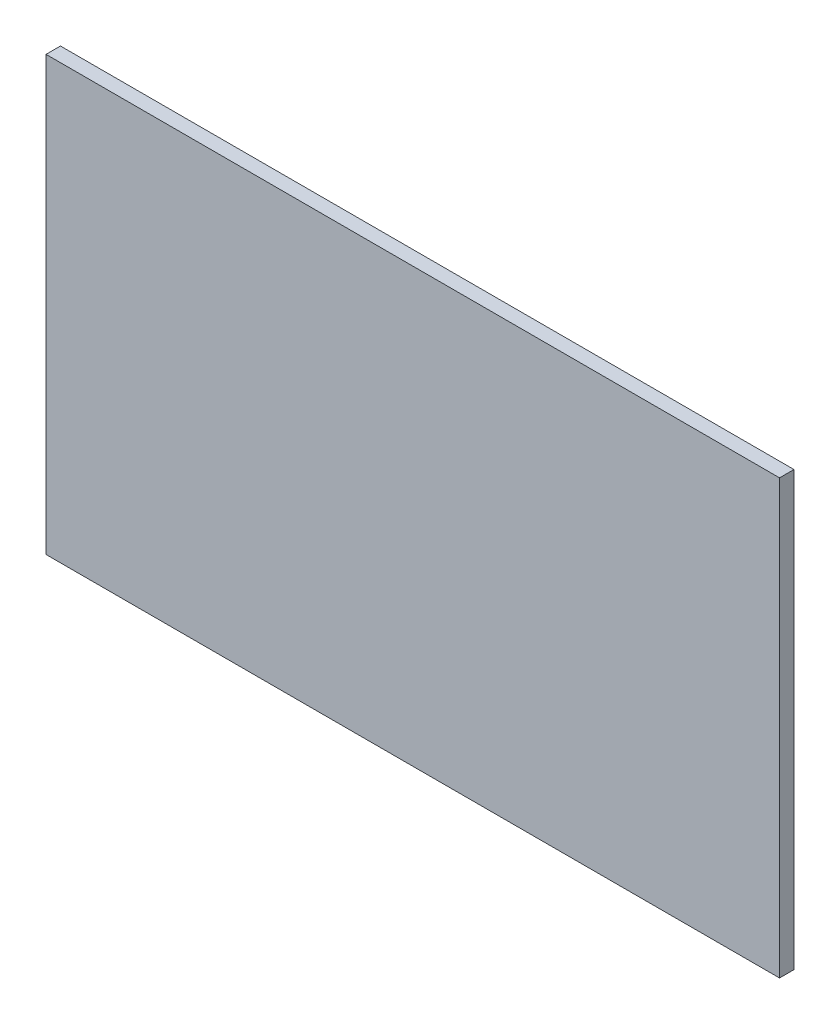
ISO-10303-21;
HEADER;
FILE_DESCRIPTION(('STEP AP214'),'2;1');
FILE_NAME('part.step','',(''),(''),'','','');
FILE_SCHEMA(('AUTOMOTIVE_DESIGN { 1 0 10303 214 1 1 1 1 }'));
ENDSEC;
DATA;
#1=APPLICATION_CONTEXT('core data for automotive mechanical design processes');
#2=APPLICATION_PROTOCOL_DEFINITION('international standard','automotive_design',2000,#1);
#3=PRODUCT_CONTEXT('',#1,'mechanical');
#4=PRODUCT('Part','Part','',(#3));
#5=PRODUCT_RELATED_PRODUCT_CATEGORY('part','',(#4));
#6=PRODUCT_DEFINITION_FORMATION('','',#4);
#7=PRODUCT_DEFINITION_CONTEXT('part definition',#1,'design');
#8=PRODUCT_DEFINITION('design','',#6,#7);
#9=PRODUCT_DEFINITION_SHAPE('','',#8);
#10=(LENGTH_UNIT() NAMED_UNIT(*) SI_UNIT(.MILLI.,.METRE.));
#11=(NAMED_UNIT(*) PLANE_ANGLE_UNIT() SI_UNIT($,.RADIAN.));
#12=(NAMED_UNIT(*) SI_UNIT($,.STERADIAN.) SOLID_ANGLE_UNIT());
#13=UNCERTAINTY_MEASURE_WITH_UNIT(LENGTH_MEASURE(1.E-05),#10,'distance_accuracy_value','');
#14=(GEOMETRIC_REPRESENTATION_CONTEXT(3) GLOBAL_UNCERTAINTY_ASSIGNED_CONTEXT((#13)) GLOBAL_UNIT_ASSIGNED_CONTEXT((#10,
#11,#12)) REPRESENTATION_CONTEXT('',''));
#15=CARTESIAN_POINT('',(0.,0.,0.));
#16=DIRECTION('',(0.,0.,1.));
#17=DIRECTION('',(1.,0.,0.));
#18=AXIS2_PLACEMENT_3D('',#15,#16,#17);
#19=CARTESIAN_POINT('',(25.4,-15.,1.));
#20=DIRECTION('',(-1.,0.,0.));
#21=DIRECTION('',(0.,0.,1.));
#22=AXIS2_PLACEMENT_3D('',#19,#20,#21);
#23=PLANE('',#22);
#24=DIRECTION('',(0.,1.,0.));
#25=VECTOR('',#24,1.);
#26=CARTESIAN_POINT('',(25.4,-15.,0.));
#27=LINE('',#26,#25);
#28=CARTESIAN_POINT('',(25.4,-15.,0.));
#29=VERTEX_POINT('',#28);
#30=CARTESIAN_POINT('',(25.4,15.,0.));
#31=VERTEX_POINT('',#30);
#32=EDGE_CURVE('E108',#29,#31,#27,.T.);
#33=ORIENTED_EDGE('',*,*,#32,.T.);
#34=DIRECTION('',(0.,0.,-1.));
#35=VECTOR('',#34,1.);
#36=CARTESIAN_POINT('',(25.4,15.,1.));
#37=LINE('',#36,#35);
#38=CARTESIAN_POINT('',(25.4,15.,1.));
#39=VERTEX_POINT('',#38);
#40=EDGE_CURVE('E11',#39,#31,#37,.T.);
#41=ORIENTED_EDGE('',*,*,#40,.F.);
#42=DIRECTION('',(0.,1.,0.));
#43=VECTOR('',#42,1.);
#44=CARTESIAN_POINT('',(25.4,-15.,1.));
#45=LINE('',#44,#43);
#46=CARTESIAN_POINT('',(25.4,-15.,1.));
#47=VERTEX_POINT('',#46);
#48=EDGE_CURVE('E89',#47,#39,#45,.T.);
#49=ORIENTED_EDGE('',*,*,#48,.F.);
#50=DIRECTION('',(0.,0.,-1.));
#51=VECTOR('',#50,1.);
#52=CARTESIAN_POINT('',(25.4,-15.,1.));
#53=LINE('',#52,#51);
#54=EDGE_CURVE('E104',#47,#29,#53,.T.);
#55=ORIENTED_EDGE('',*,*,#54,.T.);
#56=EDGE_LOOP('',(#33,#41,#49,#55));
#57=FACE_BOUND('',#56,.T.);
#58=ADVANCED_FACE('F37',(#57),#23,.F.);
#59=CARTESIAN_POINT('',(-25.4,15.,1.));
#60=DIRECTION('',(0.,-1.,0.));
#61=DIRECTION('',(0.,0.,-1.));
#62=AXIS2_PLACEMENT_3D('',#59,#60,#61);
#63=PLANE('',#62);
#64=DIRECTION('',(-1.,0.,0.));
#65=VECTOR('',#64,1.);
#66=CARTESIAN_POINT('',(-25.4,15.,0.));
#67=LINE('',#66,#65);
#68=CARTESIAN_POINT('',(-25.4,15.,0.));
#69=VERTEX_POINT('',#68);
#70=EDGE_CURVE('E94',#31,#69,#67,.T.);
#71=ORIENTED_EDGE('',*,*,#70,.T.);
#72=DIRECTION('',(0.,0.,-1.));
#73=VECTOR('',#72,1.);
#74=CARTESIAN_POINT('',(-25.4,15.,1.));
#75=LINE('',#74,#73);
#76=CARTESIAN_POINT('',(-25.4,15.,1.));
#77=VERTEX_POINT('',#76);
#78=EDGE_CURVE('E46',#77,#69,#75,.T.);
#79=ORIENTED_EDGE('',*,*,#78,.F.);
#80=DIRECTION('',(-1.,0.,0.));
#81=VECTOR('',#80,1.);
#82=CARTESIAN_POINT('',(-25.4,15.,1.));
#83=LINE('',#82,#81);
#84=EDGE_CURVE('E84',#39,#77,#83,.T.);
#85=ORIENTED_EDGE('',*,*,#84,.F.);
#86=ORIENTED_EDGE('',*,*,#40,.T.);
#87=EDGE_LOOP('',(#71,#79,#85,#86));
#88=FACE_BOUND('',#87,.T.);
#89=ADVANCED_FACE('F93',(#88),#63,.F.);
#90=CARTESIAN_POINT('',(-25.4,-15.,1.));
#91=DIRECTION('',(1.,0.,0.));
#92=DIRECTION('',(0.,0.,-1.));
#93=AXIS2_PLACEMENT_3D('',#90,#91,#92);
#94=PLANE('',#93);
#95=DIRECTION('',(0.,-1.,0.));
#96=VECTOR('',#95,1.);
#97=CARTESIAN_POINT('',(-25.4,-15.,0.));
#98=LINE('',#97,#96);
#99=CARTESIAN_POINT('',(-25.4,-15.,0.));
#100=VERTEX_POINT('',#99);
#101=EDGE_CURVE('E71',#69,#100,#98,.T.);
#102=ORIENTED_EDGE('',*,*,#101,.T.);
#103=DIRECTION('',(0.,0.,-1.));
#104=VECTOR('',#103,1.);
#105=CARTESIAN_POINT('',(-25.4,-15.,1.));
#106=LINE('',#105,#104);
#107=CARTESIAN_POINT('',(-25.4,-15.,1.));
#108=VERTEX_POINT('',#107);
#109=EDGE_CURVE('E96',#108,#100,#106,.T.);
#110=ORIENTED_EDGE('',*,*,#109,.F.);
#111=DIRECTION('',(0.,-1.,0.));
#112=VECTOR('',#111,1.);
#113=CARTESIAN_POINT('',(-25.4,-15.,1.));
#114=LINE('',#113,#112);
#115=EDGE_CURVE('E87',#77,#108,#114,.T.);
#116=ORIENTED_EDGE('',*,*,#115,.F.);
#117=ORIENTED_EDGE('',*,*,#78,.T.);
#118=EDGE_LOOP('',(#102,#110,#116,#117));
#119=FACE_BOUND('',#118,.T.);
#120=ADVANCED_FACE('F97',(#119),#94,.F.);
#121=CARTESIAN_POINT('',(-25.4,-15.,1.));
#122=DIRECTION('',(0.,1.,0.));
#123=DIRECTION('',(0.,0.,1.));
#124=AXIS2_PLACEMENT_3D('',#121,#122,#123);
#125=PLANE('',#124);
#126=DIRECTION('',(1.,0.,0.));
#127=VECTOR('',#126,1.);
#128=CARTESIAN_POINT('',(-25.4,-15.,0.));
#129=LINE('',#128,#127);
#130=EDGE_CURVE('E77',#100,#29,#129,.T.);
#131=ORIENTED_EDGE('',*,*,#130,.T.);
#132=ORIENTED_EDGE('',*,*,#54,.F.);
#133=DIRECTION('',(1.,0.,0.));
#134=VECTOR('',#133,1.);
#135=CARTESIAN_POINT('',(-25.4,-15.,1.));
#136=LINE('',#135,#134);
#137=EDGE_CURVE('E54',#108,#47,#136,.T.);
#138=ORIENTED_EDGE('',*,*,#137,.F.);
#139=ORIENTED_EDGE('',*,*,#109,.T.);
#140=EDGE_LOOP('',(#131,#132,#138,#139));
#141=FACE_BOUND('',#140,.T.);
#142=ADVANCED_FACE('F120',(#141),#125,.F.);
#143=CARTESIAN_POINT('',(0.,0.,1.));
#144=DIRECTION('',(0.,0.,-1.));
#145=DIRECTION('',(-1.,0.,0.));
#146=AXIS2_PLACEMENT_3D('',#143,#144,#145);
#147=PLANE('',#146);
#148=ORIENTED_EDGE('',*,*,#48,.T.);
#149=ORIENTED_EDGE('',*,*,#84,.T.);
#150=ORIENTED_EDGE('',*,*,#115,.T.);
#151=ORIENTED_EDGE('',*,*,#137,.T.);
#152=EDGE_LOOP('',(#148,#149,#150,#151));
#153=FACE_BOUND('',#152,.T.);
#154=ADVANCED_FACE('F85',(#153),#147,.F.);
#155=CARTESIAN_POINT('',(0.,0.,0.));
#156=DIRECTION('',(0.,0.,-1.));
#157=DIRECTION('',(-1.,0.,0.));
#158=AXIS2_PLACEMENT_3D('',#155,#156,#157);
#159=PLANE('',#158);
#160=ORIENTED_EDGE('',*,*,#32,.F.);
#161=ORIENTED_EDGE('',*,*,#130,.F.);
#162=ORIENTED_EDGE('',*,*,#101,.F.);
#163=ORIENTED_EDGE('',*,*,#70,.F.);
#164=EDGE_LOOP('',(#160,#161,#162,#163));
#165=FACE_BOUND('',#164,.T.);
#166=ADVANCED_FACE('F123',(#165),#159,.T.);
#167=CLOSED_SHELL('',(#58,#89,#120,#142,#154,#166));
#168=MANIFOLD_SOLID_BREP('B2',#167);
#169=ADVANCED_BREP_SHAPE_REPRESENTATION('',(#18,#168),#14);
#170=SHAPE_DEFINITION_REPRESENTATION(#9,#169);
ENDSEC;
END-ISO-10303-21;
